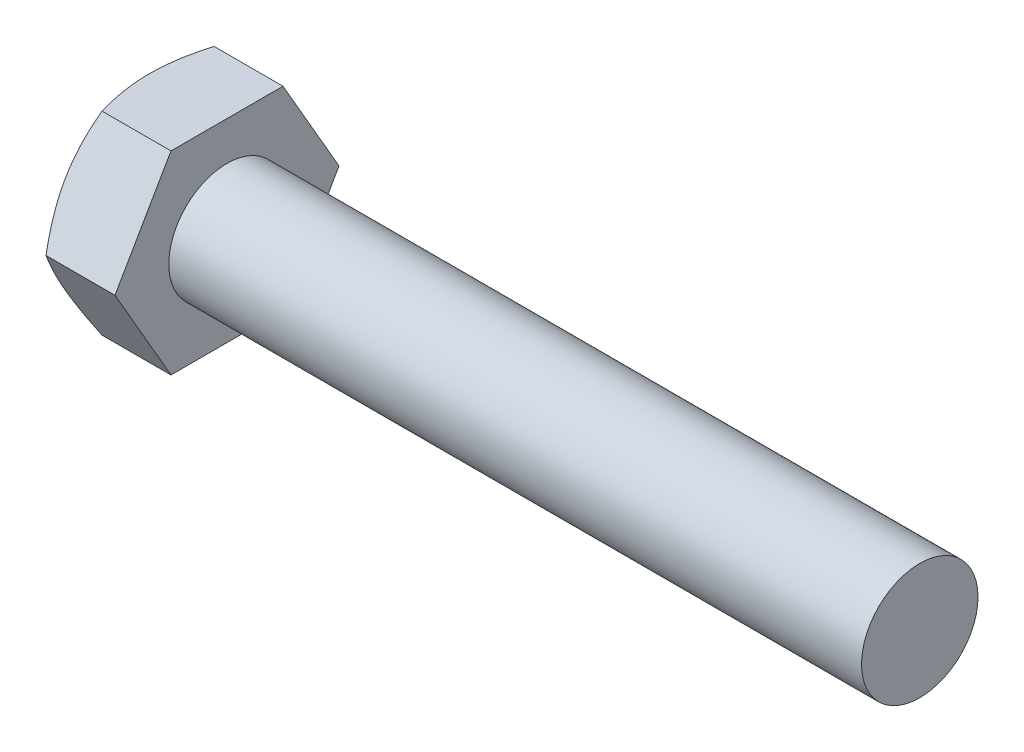
ISO-10303-21;
HEADER;
FILE_DESCRIPTION(('STEP AP214'),'2;1');
FILE_NAME('part.step','',(''),(''),'','','');
FILE_SCHEMA(('AUTOMOTIVE_DESIGN { 1 0 10303 214 1 1 1 1 }'));
ENDSEC;
DATA;
#1=APPLICATION_CONTEXT('core data for automotive mechanical design processes');
#2=APPLICATION_PROTOCOL_DEFINITION('international standard','automotive_design',2000,#1);
#3=PRODUCT_CONTEXT('',#1,'mechanical');
#4=PRODUCT('Part','Part','',(#3));
#5=PRODUCT_RELATED_PRODUCT_CATEGORY('part','',(#4));
#6=PRODUCT_DEFINITION_FORMATION('','',#4);
#7=PRODUCT_DEFINITION_CONTEXT('part definition',#1,'design');
#8=PRODUCT_DEFINITION('design','',#6,#7);
#9=PRODUCT_DEFINITION_SHAPE('','',#8);
#10=(LENGTH_UNIT() NAMED_UNIT(*) SI_UNIT(.MILLI.,.METRE.));
#11=(NAMED_UNIT(*) PLANE_ANGLE_UNIT() SI_UNIT($,.RADIAN.));
#12=(NAMED_UNIT(*) SI_UNIT($,.STERADIAN.) SOLID_ANGLE_UNIT());
#13=UNCERTAINTY_MEASURE_WITH_UNIT(LENGTH_MEASURE(1.E-05),#10,'distance_accuracy_value','');
#14=(GEOMETRIC_REPRESENTATION_CONTEXT(3) GLOBAL_UNCERTAINTY_ASSIGNED_CONTEXT((#13)) GLOBAL_UNIT_ASSIGNED_CONTEXT((#10,
#11,#12)) REPRESENTATION_CONTEXT('',''));
#15=CARTESIAN_POINT('',(0.,0.,0.));
#16=DIRECTION('',(0.,0.,1.));
#17=DIRECTION('',(1.,0.,0.));
#18=AXIS2_PLACEMENT_3D('',#15,#16,#17);
#19=CARTESIAN_POINT('',(35.7,0.,0.));
#20=DIRECTION('',(-1.,0.,0.));
#21=DIRECTION('',(0.,0.,-1.));
#22=AXIS2_PLACEMENT_3D('',#19,#20,#21);
#23=CYLINDRICAL_SURFACE('',#22,3.);
#24=CARTESIAN_POINT('',(35.7,0.,0.));
#25=DIRECTION('',(-1.,0.,0.));
#26=DIRECTION('',(0.,0.,1.));
#27=AXIS2_PLACEMENT_3D('',#24,#25,#26);
#28=CIRCLE('',#27,3.);
#29=CARTESIAN_POINT('',(35.7,0.,-3.));
#30=VERTEX_POINT('',#29);
#31=EDGE_CURVE('E151',#30,#30,#28,.T.);
#32=CARTESIAN_POINT('',(0.,0.,0.));
#33=DIRECTION('',(-1.,0.,0.));
#34=DIRECTION('',(0.,0.,1.));
#35=AXIS2_PLACEMENT_3D('',#32,#33,#34);
#36=CIRCLE('',#35,3.);
#37=CARTESIAN_POINT('',(0.,0.,-3.));
#38=VERTEX_POINT('',#37);
#39=EDGE_CURVE('E150',#38,#38,#36,.T.);
#40=CARTESIAN_POINT('',(35.7,0.,-3.));
#41=CARTESIAN_POINT('',(35.328125,0.,-3.));
#42=CARTESIAN_POINT('',(34.95625,0.,-3.));
#43=CARTESIAN_POINT('',(34.2125,0.,-3.));
#44=CARTESIAN_POINT('',(33.840625,0.,-3.));
#45=CARTESIAN_POINT('',(33.096875,0.,-3.));
#46=CARTESIAN_POINT('',(32.725,0.,-3.));
#47=CARTESIAN_POINT('',(31.98125,0.,-3.));
#48=CARTESIAN_POINT('',(31.609375,0.,-3.));
#49=CARTESIAN_POINT('',(30.865625,0.,-3.));
#50=CARTESIAN_POINT('',(30.49375,0.,-3.));
#51=CARTESIAN_POINT('',(29.75,0.,-3.));
#52=CARTESIAN_POINT('',(29.378125,0.,-3.));
#53=CARTESIAN_POINT('',(28.634375,0.,-3.));
#54=CARTESIAN_POINT('',(28.2625,0.,-3.));
#55=CARTESIAN_POINT('',(27.51875,0.,-3.));
#56=CARTESIAN_POINT('',(27.146875,0.,-3.));
#57=CARTESIAN_POINT('',(26.403125,0.,-3.));
#58=CARTESIAN_POINT('',(26.03125,0.,-3.));
#59=CARTESIAN_POINT('',(25.2875,0.,-3.));
#60=CARTESIAN_POINT('',(24.915625,0.,-3.));
#61=CARTESIAN_POINT('',(24.171875,0.,-3.));
#62=CARTESIAN_POINT('',(23.8,0.,-3.));
#63=CARTESIAN_POINT('',(23.05625,0.,-3.));
#64=CARTESIAN_POINT('',(22.684375,0.,-3.));
#65=CARTESIAN_POINT('',(21.940625,0.,-3.));
#66=CARTESIAN_POINT('',(21.56875,0.,-3.));
#67=CARTESIAN_POINT('',(20.825,0.,-3.));
#68=CARTESIAN_POINT('',(20.453125,0.,-3.));
#69=CARTESIAN_POINT('',(19.709375,0.,-3.));
#70=CARTESIAN_POINT('',(19.3375,0.,-3.));
#71=CARTESIAN_POINT('',(18.59375,0.,-3.));
#72=CARTESIAN_POINT('',(18.221875,0.,-3.));
#73=CARTESIAN_POINT('',(17.478125,0.,-3.));
#74=CARTESIAN_POINT('',(17.10625,0.,-3.));
#75=CARTESIAN_POINT('',(16.3625,0.,-3.));
#76=CARTESIAN_POINT('',(15.990625,0.,-3.));
#77=CARTESIAN_POINT('',(15.246875,0.,-3.));
#78=CARTESIAN_POINT('',(14.875,0.,-3.));
#79=CARTESIAN_POINT('',(14.13125,0.,-3.));
#80=CARTESIAN_POINT('',(13.759375,0.,-3.));
#81=CARTESIAN_POINT('',(13.015625,0.,-3.));
#82=CARTESIAN_POINT('',(12.64375,0.,-3.));
#83=CARTESIAN_POINT('',(11.9,0.,-3.));
#84=CARTESIAN_POINT('',(11.528125,0.,-3.));
#85=CARTESIAN_POINT('',(10.784375,0.,-3.));
#86=CARTESIAN_POINT('',(10.4125,0.,-3.));
#87=CARTESIAN_POINT('',(9.66875,0.,-3.));
#88=CARTESIAN_POINT('',(9.296875,0.,-3.));
#89=CARTESIAN_POINT('',(8.553125,0.,-3.));
#90=CARTESIAN_POINT('',(8.18125,0.,-3.));
#91=CARTESIAN_POINT('',(7.4375,0.,-3.));
#92=CARTESIAN_POINT('',(7.065625,0.,-3.));
#93=CARTESIAN_POINT('',(6.321875,0.,-3.));
#94=CARTESIAN_POINT('',(5.95,0.,-3.));
#95=CARTESIAN_POINT('',(5.20625,0.,-3.));
#96=CARTESIAN_POINT('',(4.834375,0.,-3.));
#97=CARTESIAN_POINT('',(4.090625,0.,-3.));
#98=CARTESIAN_POINT('',(3.71875,0.,-3.));
#99=CARTESIAN_POINT('',(2.975,0.,-3.));
#100=CARTESIAN_POINT('',(2.603125,0.,-3.));
#101=CARTESIAN_POINT('',(1.859375,0.,-3.));
#102=CARTESIAN_POINT('',(1.4875,0.,-3.));
#103=CARTESIAN_POINT('',(0.743750000000002,0.,-3.));
#104=CARTESIAN_POINT('',(0.371875000000001,0.,-3.));
#105=CARTESIAN_POINT('',(0.,0.,-3.));
#106=B_SPLINE_CURVE_WITH_KNOTS('',3,(#40,#41,#42,#43,#44,#45,#46,#47,#48,#49,#50,#51,#52,#53,
#54,#55,#56,#57,#58,#59,#60,#61,#62,#63,#64,#65,#66,#67,#68,#69,#70,#71,#72,#73,#74,#75,#76,#77,
#78,#79,#80,#81,#82,#83,#84,#85,#86,#87,#88,#89,#90,#91,#92,#93,#94,#95,#96,#97,#98,#99,#100,
#101,#102,#103,#104,#105),.UNSPECIFIED.,.F.,.F.,(4,2,2,2,2,2,2,2,2,2,2,2,2,2,2,2,2,2,2,2,2,2,2,
2,2,2,2,2,2,2,2,2,4),(0.,1.115625,2.23125,3.346875,4.4625,5.578125,6.69375,7.809375,8.925,
10.040625,11.15625,12.271875,13.3875,14.503125,15.61875,16.734375,17.85,18.965625,20.08125,
21.196875,22.3125,23.428125,24.54375,25.659375,26.775,27.890625,29.00625,30.121875,31.2375,
32.353125,33.46875,34.584375,35.7),.UNSPECIFIED.);
#107=EDGE_CURVE('BSEAM43',#30,#38,#106,.T.);
#108=ORIENTED_EDGE('',*,*,#31,.T.);
#109=ORIENTED_EDGE('',*,*,#39,.F.);
#110=ORIENTED_EDGE('',*,*,#107,.T.);
#111=ORIENTED_EDGE('',*,*,#107,.F.);
#112=EDGE_LOOP('',(#108,#110,#109,#111));
#113=FACE_BOUND('',#112,.T.);
#114=ADVANCED_FACE('F43',(#113),#23,.T.);
#115=CARTESIAN_POINT('',(35.7,0.,0.));
#116=DIRECTION('',(1.,0.,0.));
#117=DIRECTION('',(0.,0.,1.));
#118=AXIS2_PLACEMENT_3D('',#115,#116,#117);
#119=PLANE('',#118);
#120=ORIENTED_EDGE('',*,*,#31,.F.);
#121=EDGE_LOOP('',(#120));
#122=FACE_BOUND('',#121,.T.);
#123=ADVANCED_FACE('F160',(#122),#119,.T.);
#124=CARTESIAN_POINT('',(-4.,-5.,-2.88675134594813));
#125=DIRECTION('',(0.,0.5,0.866025403784439));
#126=DIRECTION('',(0.,0.866025403784439,-0.5));
#127=AXIS2_PLACEMENT_3D('',#124,#125,#126);
#128=PLANE('',#127);
#129=DIRECTION('',(1.,0.,0.));
#130=VECTOR('',#129,1.);
#131=CARTESIAN_POINT('',(-4.,0.,-5.77350269189626));
#132=LINE('',#131,#130);
#133=CARTESIAN_POINT('',(-3.5534180126148,0.,-5.77350269189626));
#134=VERTEX_POINT('',#133);
#135=CARTESIAN_POINT('',(0.,0.,-5.77350269189626));
#136=VERTEX_POINT('',#135);
#137=EDGE_CURVE('E147',#134,#136,#132,.T.);
#138=ORIENTED_EDGE('',*,*,#137,.T.);
#139=DIRECTION('',(0.,0.866025403784439,-0.5));
#140=VECTOR('',#139,1.);
#141=CARTESIAN_POINT('',(0.,-5.,-2.88675134594813));
#142=LINE('',#141,#140);
#143=CARTESIAN_POINT('',(0.,-5.,-2.88675134594813));
#144=VERTEX_POINT('',#143);
#145=EDGE_CURVE('E232',#144,#136,#142,.T.);
#146=ORIENTED_EDGE('',*,*,#145,.F.);
#147=DIRECTION('',(1.,0.,0.));
#148=VECTOR('',#147,1.);
#149=CARTESIAN_POINT('',(-4.,-5.,-2.88675134594813));
#150=LINE('',#149,#148);
#151=CARTESIAN_POINT('',(-3.5534180126148,-5.,-2.88675134594812));
#152=VERTEX_POINT('',#151);
#153=EDGE_CURVE('E141',#152,#144,#150,.T.);
#154=ORIENTED_EDGE('',*,*,#153,.F.);
#155=CARTESIAN_POINT('',(-3.55335134394817,0.00020000000000018,-5.7736181619501));
#156=CARTESIAN_POINT('',(-3.62661343236237,-0.219534594525185,-5.64675433465071));
#157=CARTESIAN_POINT('',(-3.69324867808191,-0.44114858445958,-5.5188054379059));
#158=CARTESIAN_POINT('',(-3.80956100898919,-0.888213995453513,-5.26069210252318));
#159=CARTESIAN_POINT('',(-3.85919695008421,-1.11367335959077,-5.13052307794721));
#160=CARTESIAN_POINT('',(-3.9364489745813,-1.56183230522351,-4.87177839004641));
#161=CARTESIAN_POINT('',(-3.96457962171651,-1.78446209310419,-4.74324302208387));
#162=CARTESIAN_POINT('',(-3.98980507804631,-2.11918990184664,-4.54998783160116));
#163=CARTESIAN_POINT('',(-3.99538654023051,-2.23084219680506,-4.48552534905128));
#164=CARTESIAN_POINT('',(-4.00079778324853,-2.4542499706738,-4.35654081066911));
#165=CARTESIAN_POINT('',(-4.00062774174179,-2.56600544629031,-4.2920187567385));
#166=CARTESIAN_POINT('',(-3.99224636820796,-2.87218423085064,-4.11524635305244));
#167=CARTESIAN_POINT('',(-3.97817022810274,-3.06650608596721,-4.00305457769146));
#168=CARTESIAN_POINT('',(-3.93353474289057,-3.4538601019977,-3.77941563226458));
#169=CARTESIAN_POINT('',(-3.90296013985249,-3.64689090137157,-3.66796924828419));
#170=CARTESIAN_POINT('',(-3.82653150637883,-4.03502534247485,-3.44387972423144));
#171=CARTESIAN_POINT('',(-3.78035362112132,-4.23007999864174,-3.3312648659868));
#172=CARTESIAN_POINT('',(-3.67554820550807,-4.61728034535877,-3.10771464157941));
#173=CARTESIAN_POINT('',(-3.61694529656263,-4.80943099540809,-2.99677641204847));
#174=CARTESIAN_POINT('',(-3.55335134394817,-5.0002,-2.88663587589429));
#175=B_SPLINE_CURVE_WITH_KNOTS('',3,(#155,#156,#157,#158,#159,#160,#161,#162,#163,#164,#165,
#166,#167,#168,#169,#170,#171,#172,#173,#174),.UNSPECIFIED.,.F.,.F.,(4,2,2,2,2,2,2,2,2,4),(0.,
0.792555841363089,1.58701660053333,2.3618153748728,2.74884076077325,3.13585419177295,
3.80962362599679,4.48401723901189,5.17336882348929,5.86136694793725),.UNSPECIFIED.);
#176=CARTESIAN_POINT('',(-4.,-2.5,-4.33012701892219));
#177=VERTEX_POINT('',#176);
#178=EDGE_CURVE('E179',#177,#152,#175,.T.);
#179=ORIENTED_EDGE('',*,*,#178,.F.);
#180=EDGE_CURVE('E119',#134,#177,#175,.T.);
#181=ORIENTED_EDGE('',*,*,#180,.F.);
#182=EDGE_LOOP('',(#138,#146,#154,#179,#181));
#183=FACE_BOUND('',#182,.T.);
#184=ADVANCED_FACE('F165',(#183),#128,.F.);
#185=CARTESIAN_POINT('',(-4.,0.,-5.77350269189626));
#186=DIRECTION('',(0.,-0.5,0.866025403784439));
#187=DIRECTION('',(0.,0.866025403784439,0.5));
#188=AXIS2_PLACEMENT_3D('',#185,#186,#187);
#189=PLANE('',#188);
#190=DIRECTION('',(1.,0.,0.));
#191=VECTOR('',#190,1.);
#192=CARTESIAN_POINT('',(-4.,5.,-2.88675134594813));
#193=LINE('',#192,#191);
#194=CARTESIAN_POINT('',(-3.5534180126148,5.,-2.88675134594812));
#195=VERTEX_POINT('',#194);
#196=CARTESIAN_POINT('',(0.,5.,-2.88675134594813));
#197=VERTEX_POINT('',#196);
#198=EDGE_CURVE('E139',#195,#197,#193,.T.);
#199=ORIENTED_EDGE('',*,*,#198,.T.);
#200=DIRECTION('',(0.,0.866025403784439,0.5));
#201=VECTOR('',#200,1.);
#202=CARTESIAN_POINT('',(0.,0.,-5.77350269189626));
#203=LINE('',#202,#201);
#204=EDGE_CURVE('E291',#136,#197,#203,.T.);
#205=ORIENTED_EDGE('',*,*,#204,.F.);
#206=ORIENTED_EDGE('',*,*,#137,.F.);
#207=CARTESIAN_POINT('',(-3.55335134394817,5.0002,-2.88663587589429));
#208=CARTESIAN_POINT('',(-3.62661343236237,4.78046540547482,-3.01349970319368));
#209=CARTESIAN_POINT('',(-3.69324867808191,4.55885141554042,-3.14144859993849));
#210=CARTESIAN_POINT('',(-3.80956100898919,4.11178600454649,-3.39956193532121));
#211=CARTESIAN_POINT('',(-3.85919695008421,3.88632664040923,-3.52973095989718));
#212=CARTESIAN_POINT('',(-3.9364489745813,3.43816769477649,-3.78847564779798));
#213=CARTESIAN_POINT('',(-3.96457962171651,3.21553790689581,-3.91701101576052));
#214=CARTESIAN_POINT('',(-3.98980507804631,2.88081009815336,-4.11026620624322));
#215=CARTESIAN_POINT('',(-3.99538654023051,2.76915780319494,-4.17472868879311));
#216=CARTESIAN_POINT('',(-4.00079778324853,2.54575002932621,-4.30371322717528));
#217=CARTESIAN_POINT('',(-4.00062774174179,2.43399455370969,-4.36823528110589));
#218=CARTESIAN_POINT('',(-3.99224636820796,2.12781576914936,-4.54500768479194));
#219=CARTESIAN_POINT('',(-3.97817022810275,1.93349391403279,-4.65719946015292));
#220=CARTESIAN_POINT('',(-3.93353474289057,1.5461398980023,-4.88083840557981));
#221=CARTESIAN_POINT('',(-3.90296013985249,1.35310909862843,-4.9922847895602));
#222=CARTESIAN_POINT('',(-3.82653150637883,0.964974657525146,-5.21637431361295));
#223=CARTESIAN_POINT('',(-3.78035362112132,0.769920001358265,-5.32898917185759));
#224=CARTESIAN_POINT('',(-3.67554820550807,0.382719654641232,-5.55253939626498));
#225=CARTESIAN_POINT('',(-3.61694529656263,0.190569004591914,-5.66347762579592));
#226=CARTESIAN_POINT('',(-3.55335134394817,-0.000199999999999711,-5.7736181619501));
#227=B_SPLINE_CURVE_WITH_KNOTS('',3,(#207,#208,#209,#210,#211,#212,#213,#214,#215,#216,#217,
#218,#219,#220,#221,#222,#223,#224,#225,#226),.UNSPECIFIED.,.F.,.F.,(4,2,2,2,2,2,2,2,2,4),(0.,
0.79255584136309,1.58701660053333,2.3618153748728,2.74884076077325,3.13585419177294,
3.80962362599679,4.48401723901189,5.17336882348928,5.86136694793725),.UNSPECIFIED.);
#228=CARTESIAN_POINT('',(-4.,2.5,-4.33012701892219));
#229=VERTEX_POINT('',#228);
#230=EDGE_CURVE('E128',#229,#134,#227,.T.);
#231=ORIENTED_EDGE('',*,*,#230,.F.);
#232=EDGE_CURVE('E224',#195,#229,#227,.T.);
#233=ORIENTED_EDGE('',*,*,#232,.F.);
#234=EDGE_LOOP('',(#199,#205,#206,#231,#233));
#235=FACE_BOUND('',#234,.T.);
#236=ADVANCED_FACE('F171',(#235),#189,.F.);
#237=CARTESIAN_POINT('',(-4.,5.,-2.88675134594813));
#238=DIRECTION('',(0.,-1.,0.));
#239=DIRECTION('',(0.,0.,1.));
#240=AXIS2_PLACEMENT_3D('',#237,#238,#239);
#241=PLANE('',#240);
#242=DIRECTION('',(1.,0.,0.));
#243=VECTOR('',#242,1.);
#244=CARTESIAN_POINT('',(-4.,5.,2.88675134594813));
#245=LINE('',#244,#243);
#246=CARTESIAN_POINT('',(-3.5534180126148,5.,2.88675134594813));
#247=VERTEX_POINT('',#246);
#248=CARTESIAN_POINT('',(0.,5.,2.88675134594813));
#249=VERTEX_POINT('',#248);
#250=EDGE_CURVE('E135',#247,#249,#245,.T.);
#251=ORIENTED_EDGE('',*,*,#250,.T.);
#252=DIRECTION('',(0.,0.,1.));
#253=VECTOR('',#252,1.);
#254=CARTESIAN_POINT('',(0.,5.,-2.88675134594813));
#255=LINE('',#254,#253);
#256=EDGE_CURVE('E289',#197,#249,#255,.T.);
#257=ORIENTED_EDGE('',*,*,#256,.F.);
#258=ORIENTED_EDGE('',*,*,#198,.F.);
#259=CARTESIAN_POINT('',(-1.10452353026786,5.,8.67769989901018));
#260=CARTESIAN_POINT('',(-1.208411678307,5.,8.46999549957049));
#261=CARTESIAN_POINT('',(-1.31158263221653,5.,8.26192857152029));
#262=CARTESIAN_POINT('',(-1.51614356461213,5.,7.84490442766506));
#263=CARTESIAN_POINT('',(-1.61753342363025,5.,7.63594715329878));
#264=CARTESIAN_POINT('',(-1.8183738670025,5.,7.2165824620712));
#265=CARTESIAN_POINT('',(-1.91782012916566,5.,7.00617297083903));
#266=CARTESIAN_POINT('',(-2.11408085398133,5.,6.58413282248084));
#267=CARTESIAN_POINT('',(-2.21089536817885,5.,6.37250218937048));
#268=CARTESIAN_POINT('',(-2.40556869365117,5.,5.93822918094828));
#269=CARTESIAN_POINT('',(-2.50327849061294,5.,5.71551978557233));
#270=CARTESIAN_POINT('',(-2.69424698877124,5.,5.26820250921387));
#271=CARTESIAN_POINT('',(-2.78750584516143,5.,5.04359469474662));
#272=CARTESIAN_POINT('',(-2.96832455795079,5.,4.59223463012096));
#273=CARTESIAN_POINT('',(-3.05588769993605,5.,4.36548370425787));
#274=CARTESIAN_POINT('',(-3.22378244712704,5.,3.90933222338445));
#275=CARTESIAN_POINT('',(-3.30411484466864,5.,3.67993196180087));
#276=CARTESIAN_POINT('',(-3.4732919444061,5.,3.16390484606838));
#277=CARTESIAN_POINT('',(-3.5597158711951,5.,2.87647211871409));
#278=CARTESIAN_POINT('',(-3.71355971006833,5.,2.29642431473556));
#279=CARTESIAN_POINT('',(-3.78098132997756,5.,2.0038097063448));
#280=CARTESIAN_POINT('',(-3.86312218276578,5.,1.5639187607611));
#281=CARTESIAN_POINT('',(-3.8872097352011,5.,1.41837577964727));
#282=CARTESIAN_POINT('',(-3.92878586653768,5.,1.12635842901189));
#283=CARTESIAN_POINT('',(-3.94627539907545,5.,0.979884197201749));
#284=CARTESIAN_POINT('',(-3.97413236405401,5.,0.686297290424494));
#285=CARTESIAN_POINT('',(-3.98450184744371,5.,0.539184811603662));
#286=CARTESIAN_POINT('',(-3.99779052304871,5.,0.244620623595926));
#287=CARTESIAN_POINT('',(-4.00070974658334,5.,0.0971689158376774));
#288=CARTESIAN_POINT('',(-3.99899344261343,5.,-0.198573402575844));
#289=CARTESIAN_POINT('',(-3.99431256971376,5.,-0.34686374918098));
#290=CARTESIAN_POINT('',(-3.9774702731888,5.,-0.643014838668123));
#291=CARTESIAN_POINT('',(-3.96530881632949,5.,-0.790875579638588));
#292=CARTESIAN_POINT('',(-3.93389230888483,5.,-1.0858920423211));
#293=CARTESIAN_POINT('',(-3.91463457364897,5.,-1.23304747583125));
#294=CARTESIAN_POINT('',(-3.86959263924468,5.,-1.52634780050896));
#295=CARTESIAN_POINT('',(-3.84380821166372,5.,-1.67249265612574));
#296=CARTESIAN_POINT('',(-3.75668256988162,5.,-2.11408994754182));
#297=CARTESIAN_POINT('',(-3.68613563774428,5.,-2.40773999823979));
#298=CARTESIAN_POINT('',(-3.52649261863847,5.,-2.98996510032815));
#299=CARTESIAN_POINT('',(-3.43738610188605,5.,-3.2785371987903));
#300=CARTESIAN_POINT('',(-3.26587062387846,5.,-3.790241794612));
#301=CARTESIAN_POINT('',(-3.18605773283768,5.,-4.01425747334157));
#302=CARTESIAN_POINT('',(-3.01978602799212,5.,-4.45972536136056));
#303=CARTESIAN_POINT('',(-2.93332904329825,5.,-4.6811782570017));
#304=CARTESIAN_POINT('',(-2.75511770374831,5.,-5.12210633953825));
#305=CARTESIAN_POINT('',(-2.66335976385622,5.,-5.34158006915495));
#306=CARTESIAN_POINT('',(-2.47568479264989,5.,-5.77874375147833));
#307=CARTESIAN_POINT('',(-2.37976763007032,5.,-5.99643364762894));
#308=CARTESIAN_POINT('',(-2.18872983291713,5.,-6.4211505710805));
#309=CARTESIAN_POINT('',(-2.09374666202136,5.,-6.62823962150207));
#310=CARTESIAN_POINT('',(-1.90129295898707,5.,-7.04125269120469));
#311=CARTESIAN_POINT('',(-1.80382246544802,5.,-7.24717672850447));
#312=CARTESIAN_POINT('',(-1.6070113926853,5.,-7.65767872257997));
#313=CARTESIAN_POINT('',(-1.50767443156454,5.,-7.86225841752673));
#314=CARTESIAN_POINT('',(-1.30729574837575,5.,-8.27057470184742));
#315=CARTESIAN_POINT('',(-1.20625407390076,5.,-8.47431131456183));
#316=CARTESIAN_POINT('',(-1.10452353026786,5.,-8.67769989901018));
#317=B_SPLINE_CURVE_WITH_KNOTS('',3,(#259,#260,#261,#262,#263,#264,#265,#266,#267,#268,#269,
#270,#271,#272,#273,#274,#275,#276,#277,#278,#279,#280,#281,#282,#283,#284,#285,#286,#287,#288,
#289,#290,#291,#292,#293,#294,#295,#296,#297,#298,#299,#300,#301,#302,#303,#304,#305,#306,#307,
#308,#309,#310,#311,#312,#313,#314,#315,#316),.UNSPECIFIED.,.F.,.F.,(4,2,2,2,2,2,2,2,2,2,2,2,2,
2,2,2,2,2,2,2,2,2,2,2,2,2,2,2,4),(0.,0.69671365657365,1.39347386853974,2.09163890900885,
2.78979026545806,3.51935463562382,4.24889354901043,4.97800782414732,5.70704210634686,
6.6070202336335,7.50691744992128,7.94935972093777,8.39173801959499,8.83398883650023,
9.27623779427301,9.7211351062603,10.1660343948096,10.6111021699031,11.0561855230418,
11.9612951407398,12.8669147747757,13.58021856303,14.2933266782872,15.0069228464768,
15.720541552222,16.4040197454066,17.0874873384909,17.7697443652452,18.4519823758207),.UNSPECIFIED.);
#318=CARTESIAN_POINT('',(-4.,5.,0.));
#319=VERTEX_POINT('',#318);
#320=EDGE_CURVE('E225',#319,#195,#317,.T.);
#321=ORIENTED_EDGE('',*,*,#320,.F.);
#322=EDGE_CURVE('E231',#247,#319,#317,.T.);
#323=ORIENTED_EDGE('',*,*,#322,.F.);
#324=EDGE_LOOP('',(#251,#257,#258,#321,#323));
#325=FACE_BOUND('',#324,.T.);
#326=ADVANCED_FACE('F234',(#325),#241,.F.);
#327=CARTESIAN_POINT('',(-4.,5.,2.88675134594813));
#328=DIRECTION('',(0.,-0.5,-0.866025403784439));
#329=DIRECTION('',(0.,-0.866025403784439,0.5));
#330=AXIS2_PLACEMENT_3D('',#327,#328,#329);
#331=PLANE('',#330);
#332=DIRECTION('',(1.,0.,0.));
#333=VECTOR('',#332,1.);
#334=CARTESIAN_POINT('',(-4.,0.,5.77350269189626));
#335=LINE('',#334,#333);
#336=CARTESIAN_POINT('',(-3.5534180126148,0.,5.77350269189626));
#337=VERTEX_POINT('',#336);
#338=CARTESIAN_POINT('',(0.,0.,5.77350269189626));
#339=VERTEX_POINT('',#338);
#340=EDGE_CURVE('E125',#337,#339,#335,.T.);
#341=ORIENTED_EDGE('',*,*,#340,.T.);
#342=DIRECTION('',(0.,-0.866025403784439,0.5));
#343=VECTOR('',#342,1.);
#344=CARTESIAN_POINT('',(0.,5.,2.88675134594813));
#345=LINE('',#344,#343);
#346=EDGE_CURVE('E287',#249,#339,#345,.T.);
#347=ORIENTED_EDGE('',*,*,#346,.F.);
#348=ORIENTED_EDGE('',*,*,#250,.F.);
#349=CARTESIAN_POINT('',(-3.55335134394817,-0.000199999999999485,5.77361816195009));
#350=CARTESIAN_POINT('',(-3.62661343236237,0.219534594525185,5.6467543346507));
#351=CARTESIAN_POINT('',(-3.69324867808191,0.441148584459581,5.51880543790589));
#352=CARTESIAN_POINT('',(-3.80956100898919,0.888213995453513,5.26069210252318));
#353=CARTESIAN_POINT('',(-3.85919695008421,1.11367335959077,5.13052307794721));
#354=CARTESIAN_POINT('',(-3.9364489745813,1.56183230522351,4.87177839004641));
#355=CARTESIAN_POINT('',(-3.96457962171651,1.78446209310419,4.74324302208387));
#356=CARTESIAN_POINT('',(-3.98980507804631,2.11918990184664,4.54998783160116));
#357=CARTESIAN_POINT('',(-3.99538654023051,2.23084219680506,4.48552534905128));
#358=CARTESIAN_POINT('',(-4.00079778324853,2.45424997067379,4.35654081066911));
#359=CARTESIAN_POINT('',(-4.00062774174179,2.56600544629031,4.2920187567385));
#360=CARTESIAN_POINT('',(-3.99224636820796,2.87218423085064,4.11524635305244));
#361=CARTESIAN_POINT('',(-3.97817022810275,3.06650608596721,4.00305457769146));
#362=CARTESIAN_POINT('',(-3.93353474289057,3.4538601019977,3.77941563226457));
#363=CARTESIAN_POINT('',(-3.90296013985249,3.64689090137157,3.66796924828418));
#364=CARTESIAN_POINT('',(-3.82653150637884,4.03502534247485,3.44387972423144));
#365=CARTESIAN_POINT('',(-3.78035362112132,4.23007999864173,3.3312648659868));
#366=CARTESIAN_POINT('',(-3.67554820550807,4.61728034535877,3.1077146415794));
#367=CARTESIAN_POINT('',(-3.61694529656263,4.80943099540809,2.99677641204847));
#368=CARTESIAN_POINT('',(-3.55335134394817,5.0002,2.88663587589429));
#369=B_SPLINE_CURVE_WITH_KNOTS('',3,(#349,#350,#351,#352,#353,#354,#355,#356,#357,#358,#359,
#360,#361,#362,#363,#364,#365,#366,#367,#368),.UNSPECIFIED.,.F.,.F.,(4,2,2,2,2,2,2,2,2,4),(0.,
0.792555841363089,1.58701660053333,2.3618153748728,2.74884076077325,3.13585419177294,
3.80962362599679,4.48401723901189,5.17336882348928,5.86136694793725),.UNSPECIFIED.);
#370=CARTESIAN_POINT('',(-4.,2.5,4.33012701892219));
#371=VERTEX_POINT('',#370);
#372=EDGE_CURVE('E127',#371,#247,#369,.T.);
#373=ORIENTED_EDGE('',*,*,#372,.F.);
#374=EDGE_CURVE('E112',#337,#371,#369,.T.);
#375=ORIENTED_EDGE('',*,*,#374,.F.);
#376=EDGE_LOOP('',(#341,#347,#348,#373,#375));
#377=FACE_BOUND('',#376,.T.);
#378=ADVANCED_FACE('F124',(#377),#331,.F.);
#379=CARTESIAN_POINT('',(-4.,0.,5.77350269189626));
#380=DIRECTION('',(0.,0.5,-0.866025403784439));
#381=DIRECTION('',(0.,-0.866025403784439,-0.5));
#382=AXIS2_PLACEMENT_3D('',#379,#380,#381);
#383=PLANE('',#382);
#384=DIRECTION('',(1.,0.,0.));
#385=VECTOR('',#384,1.);
#386=CARTESIAN_POINT('',(-4.,-5.,2.88675134594813));
#387=LINE('',#386,#385);
#388=CARTESIAN_POINT('',(-3.5534180126148,-5.,2.88675134594813));
#389=VERTEX_POINT('',#388);
#390=CARTESIAN_POINT('',(0.,-5.,2.88675134594813));
#391=VERTEX_POINT('',#390);
#392=EDGE_CURVE('E136',#389,#391,#387,.T.);
#393=ORIENTED_EDGE('',*,*,#392,.T.);
#394=DIRECTION('',(0.,-0.866025403784439,-0.5));
#395=VECTOR('',#394,1.);
#396=CARTESIAN_POINT('',(0.,0.,5.77350269189626));
#397=LINE('',#396,#395);
#398=EDGE_CURVE('E133',#339,#391,#397,.T.);
#399=ORIENTED_EDGE('',*,*,#398,.F.);
#400=ORIENTED_EDGE('',*,*,#340,.F.);
#401=CARTESIAN_POINT('',(-3.55335134394817,-5.0002,2.88663587589429));
#402=CARTESIAN_POINT('',(-3.62661343236237,-4.78046540547482,3.01349970319368));
#403=CARTESIAN_POINT('',(-3.69324867808191,-4.55885141554042,3.14144859993849));
#404=CARTESIAN_POINT('',(-3.80956100898919,-4.11178600454649,3.39956193532121));
#405=CARTESIAN_POINT('',(-3.85919695008421,-3.88632664040923,3.52973095989717));
#406=CARTESIAN_POINT('',(-3.9364489745813,-3.43816769477649,3.78847564779797));
#407=CARTESIAN_POINT('',(-3.96457962171651,-3.21553790689581,3.91701101576052));
#408=CARTESIAN_POINT('',(-3.98980507804631,-2.88081009815336,4.11026620624322));
#409=CARTESIAN_POINT('',(-3.99538654023051,-2.76915780319494,4.1747286887931));
#410=CARTESIAN_POINT('',(-4.00079778324853,-2.54575002932621,4.30371322717527));
#411=CARTESIAN_POINT('',(-4.00062774174179,-2.43399455370969,4.36823528110588));
#412=CARTESIAN_POINT('',(-3.99224636820796,-2.12781576914936,4.54500768479194));
#413=CARTESIAN_POINT('',(-3.97817022810275,-1.93349391403279,4.65719946015292));
#414=CARTESIAN_POINT('',(-3.93353474289057,-1.5461398980023,4.88083840557981));
#415=CARTESIAN_POINT('',(-3.90296013985249,-1.35310909862843,4.9922847895602));
#416=CARTESIAN_POINT('',(-3.82653150637884,-0.964974657525146,5.21637431361294));
#417=CARTESIAN_POINT('',(-3.78035362112132,-0.769920001358265,5.32898917185758));
#418=CARTESIAN_POINT('',(-3.67554820550807,-0.382719654641232,5.55253939626498));
#419=CARTESIAN_POINT('',(-3.61694529656263,-0.190569004591913,5.66347762579592));
#420=CARTESIAN_POINT('',(-3.55335134394817,0.000200000000000467,5.77361816195009));
#421=B_SPLINE_CURVE_WITH_KNOTS('',3,(#401,#402,#403,#404,#405,#406,#407,#408,#409,#410,#411,
#412,#413,#414,#415,#416,#417,#418,#419,#420),.UNSPECIFIED.,.F.,.F.,(4,2,2,2,2,2,2,2,2,4),(0.,
0.79255584136309,1.58701660053333,2.3618153748728,2.74884076077325,3.13585419177294,
3.80962362599679,4.48401723901189,5.17336882348928,5.86136694793725),.UNSPECIFIED.);
#422=CARTESIAN_POINT('',(-4.,-2.5,4.33012701892219));
#423=VERTEX_POINT('',#422);
#424=EDGE_CURVE('E109',#423,#337,#421,.T.);
#425=ORIENTED_EDGE('',*,*,#424,.F.);
#426=EDGE_CURVE('E121',#389,#423,#421,.T.);
#427=ORIENTED_EDGE('',*,*,#426,.F.);
#428=EDGE_LOOP('',(#393,#399,#400,#425,#427));
#429=FACE_BOUND('',#428,.T.);
#430=ADVANCED_FACE('F131',(#429),#383,.F.);
#431=CARTESIAN_POINT('',(-4.,-5.,2.88675134594813));
#432=DIRECTION('',(0.,1.,0.));
#433=DIRECTION('',(0.,0.,-1.));
#434=AXIS2_PLACEMENT_3D('',#431,#432,#433);
#435=PLANE('',#434);
#436=ORIENTED_EDGE('',*,*,#153,.T.);
#437=DIRECTION('',(0.,0.,-1.));
#438=VECTOR('',#437,1.);
#439=CARTESIAN_POINT('',(0.,-5.,2.88675134594813));
#440=LINE('',#439,#438);
#441=EDGE_CURVE('E283',#391,#144,#440,.T.);
#442=ORIENTED_EDGE('',*,*,#441,.F.);
#443=ORIENTED_EDGE('',*,*,#392,.F.);
#444=CARTESIAN_POINT('',(-1.10452353026786,-5.,-8.67769989901018));
#445=CARTESIAN_POINT('',(-1.208411678307,-5.,-8.46999549957049));
#446=CARTESIAN_POINT('',(-1.31158263221652,-5.,-8.26192857152029));
#447=CARTESIAN_POINT('',(-1.51614356461213,-5.,-7.84490442766506));
#448=CARTESIAN_POINT('',(-1.61753342363025,-5.,-7.63594715329879));
#449=CARTESIAN_POINT('',(-1.8183738670025,-5.,-7.2165824620712));
#450=CARTESIAN_POINT('',(-1.91782012916566,-5.,-7.00617297083903));
#451=CARTESIAN_POINT('',(-2.11408085398133,-5.,-6.58413282248085));
#452=CARTESIAN_POINT('',(-2.21089536817885,-5.,-6.37250218937049));
#453=CARTESIAN_POINT('',(-2.40556869365117,-5.,-5.93822918094828));
#454=CARTESIAN_POINT('',(-2.50327849061294,-5.,-5.71551978557233));
#455=CARTESIAN_POINT('',(-2.69424698877124,-5.,-5.26820250921388));
#456=CARTESIAN_POINT('',(-2.78750584516143,-5.,-5.04359469474662));
#457=CARTESIAN_POINT('',(-2.96832455795079,-5.,-4.59223463012096));
#458=CARTESIAN_POINT('',(-3.05588769993605,-5.,-4.36548370425788));
#459=CARTESIAN_POINT('',(-3.22378244712704,-5.,-3.90933222338445));
#460=CARTESIAN_POINT('',(-3.30411484466864,-5.,-3.67993196180087));
#461=CARTESIAN_POINT('',(-3.4732919444061,-5.,-3.16390484606839));
#462=CARTESIAN_POINT('',(-3.5597158711951,-5.,-2.8764721187141));
#463=CARTESIAN_POINT('',(-3.71355971006833,-5.,-2.29642431473557));
#464=CARTESIAN_POINT('',(-3.78098132997756,-5.,-2.0038097063448));
#465=CARTESIAN_POINT('',(-3.86312218276578,-5.,-1.5639187607611));
#466=CARTESIAN_POINT('',(-3.8872097352011,-5.,-1.41837577964727));
#467=CARTESIAN_POINT('',(-3.92878586653768,-5.,-1.12635842901189));
#468=CARTESIAN_POINT('',(-3.94627539907545,-5.,-0.979884197201751));
#469=CARTESIAN_POINT('',(-3.97413236405401,-5.,-0.686297290424497));
#470=CARTESIAN_POINT('',(-3.98450184744371,-5.,-0.539184811603665));
#471=CARTESIAN_POINT('',(-3.99779052304871,-5.,-0.244620623595929));
#472=CARTESIAN_POINT('',(-4.00070974658334,-5.,-0.0971689158376794));
#473=CARTESIAN_POINT('',(-3.99899344261343,-5.,0.198573402575841));
#474=CARTESIAN_POINT('',(-3.99431256971376,-5.,0.346863749180977));
#475=CARTESIAN_POINT('',(-3.9774702731888,-5.,0.64301483866812));
#476=CARTESIAN_POINT('',(-3.96530881632949,-5.,0.790875579638584));
#477=CARTESIAN_POINT('',(-3.93389230888483,-5.,1.08589204232109));
#478=CARTESIAN_POINT('',(-3.91463457364897,-5.,1.23304747583124));
#479=CARTESIAN_POINT('',(-3.86959263924468,-5.,1.52634780050896));
#480=CARTESIAN_POINT('',(-3.84380821166372,-5.,1.67249265612574));
#481=CARTESIAN_POINT('',(-3.75668256988162,-5.,2.11408994754182));
#482=CARTESIAN_POINT('',(-3.68613563774428,-5.,2.40773999823979));
#483=CARTESIAN_POINT('',(-3.52649261863847,-5.,2.98996510032815));
#484=CARTESIAN_POINT('',(-3.43738610188605,-5.,3.2785371987903));
#485=CARTESIAN_POINT('',(-3.26587062387846,-5.,3.79024179461199));
#486=CARTESIAN_POINT('',(-3.18605773283768,-5.,4.01425747334156));
#487=CARTESIAN_POINT('',(-3.01978602799212,-5.,4.45972536136055));
#488=CARTESIAN_POINT('',(-2.93332904329825,-5.,4.6811782570017));
#489=CARTESIAN_POINT('',(-2.75511770374831,-5.,5.12210633953825));
#490=CARTESIAN_POINT('',(-2.66335976385622,-5.,5.34158006915495));
#491=CARTESIAN_POINT('',(-2.47568479264989,-5.,5.77874375147833));
#492=CARTESIAN_POINT('',(-2.37976763007032,-5.,5.99643364762894));
#493=CARTESIAN_POINT('',(-2.18872983291713,-5.,6.4211505710805));
#494=CARTESIAN_POINT('',(-2.09374666202136,-5.,6.62823962150207));
#495=CARTESIAN_POINT('',(-1.90129295898707,-5.,7.04125269120469));
#496=CARTESIAN_POINT('',(-1.80382246544802,-5.,7.24717672850447));
#497=CARTESIAN_POINT('',(-1.6070113926853,-5.,7.65767872257996));
#498=CARTESIAN_POINT('',(-1.50767443156454,-5.,7.86225841752673));
#499=CARTESIAN_POINT('',(-1.30729574837575,-5.,8.27057470184742));
#500=CARTESIAN_POINT('',(-1.20625407390076,-5.,8.47431131456183));
#501=CARTESIAN_POINT('',(-1.10452353026786,-5.,8.67769989901018));
#502=B_SPLINE_CURVE_WITH_KNOTS('',3,(#444,#445,#446,#447,#448,#449,#450,#451,#452,#453,#454,
#455,#456,#457,#458,#459,#460,#461,#462,#463,#464,#465,#466,#467,#468,#469,#470,#471,#472,#473,
#474,#475,#476,#477,#478,#479,#480,#481,#482,#483,#484,#485,#486,#487,#488,#489,#490,#491,#492,
#493,#494,#495,#496,#497,#498,#499,#500,#501),.UNSPECIFIED.,.F.,.F.,(4,2,2,2,2,2,2,2,2,2,2,2,2,
2,2,2,2,2,2,2,2,2,2,2,2,2,2,2,4),(0.,0.696713656573651,1.39347386853974,2.09163890900886,
2.78979026545806,3.51935463562382,4.24889354901044,4.97800782414732,5.70704210634686,
6.60702023363351,7.50691744992128,7.94935972093777,8.391738019595,8.83398883650024,
9.27623779427302,9.7211351062603,10.1660343948096,10.6111021699031,11.0561855230418,
11.9612951407398,12.8669147747757,13.58021856303,14.2933266782872,15.0069228464768,
15.720541552222,16.4040197454066,17.0874873384909,17.7697443652452,18.4519823758207),.UNSPECIFIED.);
#503=CARTESIAN_POINT('',(-4.,-5.,0.));
#504=VERTEX_POINT('',#503);
#505=EDGE_CURVE('E209',#504,#389,#502,.T.);
#506=ORIENTED_EDGE('',*,*,#505,.F.);
#507=EDGE_CURVE('E271',#152,#504,#502,.T.);
#508=ORIENTED_EDGE('',*,*,#507,.F.);
#509=EDGE_LOOP('',(#436,#442,#443,#506,#508));
#510=FACE_BOUND('',#509,.T.);
#511=ADVANCED_FACE('F242',(#510),#435,.F.);
#512=CARTESIAN_POINT('',(0.,0.,0.));
#513=DIRECTION('',(-1.,0.,0.));
#514=DIRECTION('',(0.,0.,-1.));
#515=AXIS2_PLACEMENT_3D('',#512,#513,#514);
#516=PLANE('',#515);
#517=ORIENTED_EDGE('',*,*,#39,.T.);
#518=EDGE_LOOP('',(#517));
#519=FACE_BOUND('',#518,.T.);
#520=ORIENTED_EDGE('',*,*,#145,.T.);
#521=ORIENTED_EDGE('',*,*,#204,.T.);
#522=ORIENTED_EDGE('',*,*,#256,.T.);
#523=ORIENTED_EDGE('',*,*,#346,.T.);
#524=ORIENTED_EDGE('',*,*,#398,.T.);
#525=ORIENTED_EDGE('',*,*,#441,.T.);
#526=EDGE_LOOP('',(#520,#521,#522,#523,#524,#525));
#527=FACE_BOUND('',#526,.T.);
#528=ADVANCED_FACE('F156',(#519,#527),#516,.F.);
#529=CARTESIAN_POINT('',(-4.,0.,0.));
#530=DIRECTION('',(1.,0.,0.));
#531=DIRECTION('',(0.,0.,1.));
#532=AXIS2_PLACEMENT_3D('',#529,#530,#531);
#533=CONICAL_SURFACE('',#532,5.,1.0471975511966);
#534=CARTESIAN_POINT('',(-4.,0.,0.));
#535=DIRECTION('',(1.,0.,0.));
#536=DIRECTION('',(0.,0.,-1.));
#537=AXIS2_PLACEMENT_3D('',#534,#535,#536);
#538=CIRCLE('',#537,4.99999999999999);
#539=EDGE_CURVE('E46',#229,#177,#538,.F.);
#540=ORIENTED_EDGE('',*,*,#539,.F.);
#541=ORIENTED_EDGE('',*,*,#230,.T.);
#542=ORIENTED_EDGE('',*,*,#180,.T.);
#543=EDGE_LOOP('',(#540,#541,#542));
#544=FACE_BOUND('',#543,.T.);
#545=ADVANCED_FACE('F247',(#544),#533,.T.);
#546=EDGE_CURVE('E275',#319,#229,#538,.F.);
#547=ORIENTED_EDGE('',*,*,#546,.F.);
#548=ORIENTED_EDGE('',*,*,#320,.T.);
#549=ORIENTED_EDGE('',*,*,#232,.T.);
#550=EDGE_LOOP('',(#547,#548,#549));
#551=FACE_BOUND('',#550,.T.);
#552=ADVANCED_FACE('F202',(#551),#533,.T.);
#553=ORIENTED_EDGE('',*,*,#372,.T.);
#554=ORIENTED_EDGE('',*,*,#322,.T.);
#555=CARTESIAN_POINT('',(-4.,0.,0.));
#556=DIRECTION('',(-1.,0.,0.));
#557=DIRECTION('',(0.,0.,1.));
#558=AXIS2_PLACEMENT_3D('',#555,#556,#557);
#559=CIRCLE('',#558,5.);
#560=EDGE_CURVE('E297',#371,#319,#559,.T.);
#561=ORIENTED_EDGE('',*,*,#560,.F.);
#562=EDGE_LOOP('',(#553,#554,#561));
#563=FACE_BOUND('',#562,.T.);
#564=ADVANCED_FACE('F198',(#563),#533,.T.);
#565=ORIENTED_EDGE('',*,*,#424,.T.);
#566=ORIENTED_EDGE('',*,*,#374,.T.);
#567=EDGE_CURVE('E114',#423,#371,#538,.F.);
#568=ORIENTED_EDGE('',*,*,#567,.F.);
#569=EDGE_LOOP('',(#565,#566,#568));
#570=FACE_BOUND('',#569,.T.);
#571=ADVANCED_FACE('F111',(#570),#533,.T.);
#572=ORIENTED_EDGE('',*,*,#505,.T.);
#573=ORIENTED_EDGE('',*,*,#426,.T.);
#574=EDGE_CURVE('E51',#504,#423,#538,.F.);
#575=ORIENTED_EDGE('',*,*,#574,.F.);
#576=EDGE_LOOP('',(#572,#573,#575));
#577=FACE_BOUND('',#576,.T.);
#578=ADVANCED_FACE('F204',(#577),#533,.T.);
#579=EDGE_CURVE('E11',#177,#504,#538,.F.);
#580=ORIENTED_EDGE('',*,*,#579,.F.);
#581=ORIENTED_EDGE('',*,*,#178,.T.);
#582=ORIENTED_EDGE('',*,*,#507,.T.);
#583=EDGE_LOOP('',(#580,#581,#582));
#584=FACE_BOUND('',#583,.T.);
#585=ADVANCED_FACE('F258',(#584),#533,.T.);
#586=CARTESIAN_POINT('',(-4.,0.,0.));
#587=DIRECTION('',(-1.,0.,0.));
#588=DIRECTION('',(0.,0.,-1.));
#589=AXIS2_PLACEMENT_3D('',#586,#587,#588);
#590=PLANE('',#589);
#591=ORIENTED_EDGE('',*,*,#579,.T.);
#592=ORIENTED_EDGE('',*,*,#574,.T.);
#593=ORIENTED_EDGE('',*,*,#567,.T.);
#594=ORIENTED_EDGE('',*,*,#560,.T.);
#595=ORIENTED_EDGE('',*,*,#546,.T.);
#596=ORIENTED_EDGE('',*,*,#539,.T.);
#597=EDGE_LOOP('',(#591,#592,#593,#594,#595,#596));
#598=FACE_BOUND('',#597,.T.);
#599=ADVANCED_FACE('F205',(#598),#590,.T.);
#600=CLOSED_SHELL('',(#114,#123,#184,#236,#326,#378,#430,#511,#528,#545,#552,#564,#571,#578,
#585,#599));
#601=MANIFOLD_SOLID_BREP('B2',#600);
#602=ADVANCED_BREP_SHAPE_REPRESENTATION('',(#18,#601),#14);
#603=SHAPE_DEFINITION_REPRESENTATION(#9,#602);
ENDSEC;
END-ISO-10303-21;
